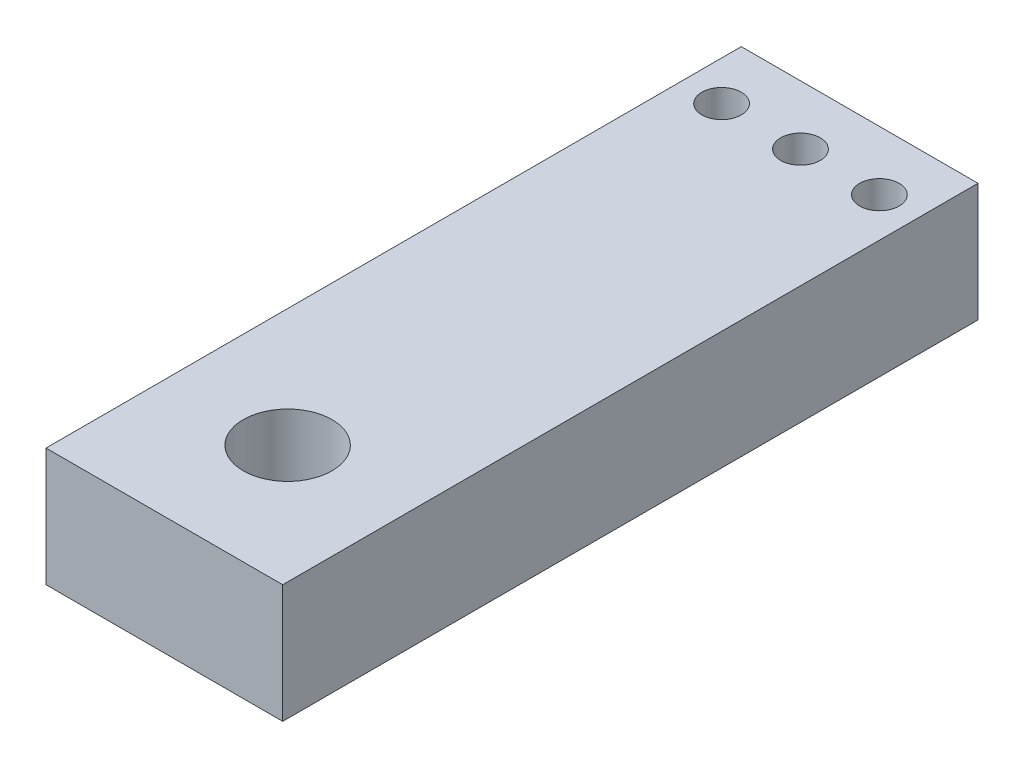
ISO-10303-21;
HEADER;
FILE_DESCRIPTION(('STEP AP214'),'2;1');
FILE_NAME('part.step','',(''),(''),'','','');
FILE_SCHEMA(('AUTOMOTIVE_DESIGN { 1 0 10303 214 1 1 1 1 }'));
ENDSEC;
DATA;
#1=APPLICATION_CONTEXT('core data for automotive mechanical design processes');
#2=APPLICATION_PROTOCOL_DEFINITION('international standard','automotive_design',2000,#1);
#3=PRODUCT_CONTEXT('',#1,'mechanical');
#4=PRODUCT('Part','Part','',(#3));
#5=PRODUCT_RELATED_PRODUCT_CATEGORY('part','',(#4));
#6=PRODUCT_DEFINITION_FORMATION('','',#4);
#7=PRODUCT_DEFINITION_CONTEXT('part definition',#1,'design');
#8=PRODUCT_DEFINITION('design','',#6,#7);
#9=PRODUCT_DEFINITION_SHAPE('','',#8);
#10=(LENGTH_UNIT() NAMED_UNIT(*) SI_UNIT(.MILLI.,.METRE.));
#11=(NAMED_UNIT(*) PLANE_ANGLE_UNIT() SI_UNIT($,.RADIAN.));
#12=(NAMED_UNIT(*) SI_UNIT($,.STERADIAN.) SOLID_ANGLE_UNIT());
#13=UNCERTAINTY_MEASURE_WITH_UNIT(LENGTH_MEASURE(1.E-05),#10,'distance_accuracy_value','');
#14=(GEOMETRIC_REPRESENTATION_CONTEXT(3) GLOBAL_UNCERTAINTY_ASSIGNED_CONTEXT((#13)) GLOBAL_UNIT_ASSIGNED_CONTEXT((#10,
#11,#12)) REPRESENTATION_CONTEXT('',''));
#15=CARTESIAN_POINT('',(0.,0.,0.));
#16=DIRECTION('',(0.,0.,1.));
#17=DIRECTION('',(1.,0.,0.));
#18=AXIS2_PLACEMENT_3D('',#15,#16,#17);
#19=CARTESIAN_POINT('',(0.,6.,0.));
#20=DIRECTION('',(1.,0.,0.));
#21=DIRECTION('',(0.,0.,-1.));
#22=AXIS2_PLACEMENT_3D('',#19,#20,#21);
#23=PLANE('',#22);
#24=DIRECTION('',(0.,0.,1.));
#25=VECTOR('',#24,1.);
#26=CARTESIAN_POINT('',(0.,0.,0.));
#27=LINE('',#26,#25);
#28=CARTESIAN_POINT('',(0.,0.,-35.25));
#29=VERTEX_POINT('',#28);
#30=CARTESIAN_POINT('',(0.,0.,0.));
#31=VERTEX_POINT('',#30);
#32=EDGE_CURVE('E98',#29,#31,#27,.T.);
#33=ORIENTED_EDGE('',*,*,#32,.T.);
#34=DIRECTION('',(0.,-1.,0.));
#35=VECTOR('',#34,1.);
#36=CARTESIAN_POINT('',(0.,6.,0.));
#37=LINE('',#36,#35);
#38=CARTESIAN_POINT('',(0.,6.,0.));
#39=VERTEX_POINT('',#38);
#40=EDGE_CURVE('E11',#39,#31,#37,.T.);
#41=ORIENTED_EDGE('',*,*,#40,.F.);
#42=DIRECTION('',(0.,0.,1.));
#43=VECTOR('',#42,1.);
#44=CARTESIAN_POINT('',(0.,6.,0.));
#45=LINE('',#44,#43);
#46=CARTESIAN_POINT('',(0.,6.,-35.25));
#47=VERTEX_POINT('',#46);
#48=EDGE_CURVE('E86',#47,#39,#45,.T.);
#49=ORIENTED_EDGE('',*,*,#48,.F.);
#50=DIRECTION('',(0.,-1.,0.));
#51=VECTOR('',#50,1.);
#52=CARTESIAN_POINT('',(0.,6.,-35.25));
#53=LINE('',#52,#51);
#54=EDGE_CURVE('E94',#47,#29,#53,.T.);
#55=ORIENTED_EDGE('',*,*,#54,.T.);
#56=EDGE_LOOP('',(#33,#41,#49,#55));
#57=FACE_BOUND('',#56,.T.);
#58=ADVANCED_FACE('F35',(#57),#23,.F.);
#59=CARTESIAN_POINT('',(0.,6.,0.));
#60=DIRECTION('',(0.,0.,-1.));
#61=DIRECTION('',(-1.,0.,0.));
#62=AXIS2_PLACEMENT_3D('',#59,#60,#61);
#63=PLANE('',#62);
#64=DIRECTION('',(1.,0.,0.));
#65=VECTOR('',#64,1.);
#66=CARTESIAN_POINT('',(0.,0.,0.));
#67=LINE('',#66,#65);
#68=CARTESIAN_POINT('',(12.,0.,0.));
#69=VERTEX_POINT('',#68);
#70=EDGE_CURVE('E90',#31,#69,#67,.T.);
#71=ORIENTED_EDGE('',*,*,#70,.T.);
#72=DIRECTION('',(0.,-1.,0.));
#73=VECTOR('',#72,1.);
#74=CARTESIAN_POINT('',(12.,6.,0.));
#75=LINE('',#74,#73);
#76=CARTESIAN_POINT('',(12.,6.,0.));
#77=VERTEX_POINT('',#76);
#78=EDGE_CURVE('E43',#77,#69,#75,.T.);
#79=ORIENTED_EDGE('',*,*,#78,.F.);
#80=DIRECTION('',(1.,0.,0.));
#81=VECTOR('',#80,1.);
#82=CARTESIAN_POINT('',(0.,6.,0.));
#83=LINE('',#82,#81);
#84=EDGE_CURVE('E81',#39,#77,#83,.T.);
#85=ORIENTED_EDGE('',*,*,#84,.F.);
#86=ORIENTED_EDGE('',*,*,#40,.T.);
#87=EDGE_LOOP('',(#71,#79,#85,#86));
#88=FACE_BOUND('',#87,.T.);
#89=ADVANCED_FACE('F89',(#88),#63,.F.);
#90=CARTESIAN_POINT('',(12.,6.,0.));
#91=DIRECTION('',(-1.,0.,0.));
#92=DIRECTION('',(0.,0.,1.));
#93=AXIS2_PLACEMENT_3D('',#90,#91,#92);
#94=PLANE('',#93);
#95=DIRECTION('',(0.,0.,-1.));
#96=VECTOR('',#95,1.);
#97=CARTESIAN_POINT('',(12.,0.,0.));
#98=LINE('',#97,#96);
#99=CARTESIAN_POINT('',(12.,0.,-35.25));
#100=VERTEX_POINT('',#99);
#101=EDGE_CURVE('E68',#69,#100,#98,.T.);
#102=ORIENTED_EDGE('',*,*,#101,.T.);
#103=DIRECTION('',(0.,-1.,0.));
#104=VECTOR('',#103,1.);
#105=CARTESIAN_POINT('',(12.,6.,-35.25));
#106=LINE('',#105,#104);
#107=CARTESIAN_POINT('',(12.,6.,-35.25));
#108=VERTEX_POINT('',#107);
#109=EDGE_CURVE('E91',#108,#100,#106,.T.);
#110=ORIENTED_EDGE('',*,*,#109,.F.);
#111=DIRECTION('',(0.,0.,-1.));
#112=VECTOR('',#111,1.);
#113=CARTESIAN_POINT('',(12.,6.,0.));
#114=LINE('',#113,#112);
#115=EDGE_CURVE('E84',#77,#108,#114,.T.);
#116=ORIENTED_EDGE('',*,*,#115,.F.);
#117=ORIENTED_EDGE('',*,*,#78,.T.);
#118=EDGE_LOOP('',(#102,#110,#116,#117));
#119=FACE_BOUND('',#118,.T.);
#120=ADVANCED_FACE('F92',(#119),#94,.F.);
#121=CARTESIAN_POINT('',(0.,6.,-35.25));
#122=DIRECTION('',(0.,0.,1.));
#123=DIRECTION('',(1.,0.,0.));
#124=AXIS2_PLACEMENT_3D('',#121,#122,#123);
#125=PLANE('',#124);
#126=DIRECTION('',(-1.,0.,0.));
#127=VECTOR('',#126,1.);
#128=CARTESIAN_POINT('',(0.,0.,-35.25));
#129=LINE('',#128,#127);
#130=EDGE_CURVE('E74',#100,#29,#129,.T.);
#131=ORIENTED_EDGE('',*,*,#130,.T.);
#132=ORIENTED_EDGE('',*,*,#54,.F.);
#133=DIRECTION('',(-1.,0.,0.));
#134=VECTOR('',#133,1.);
#135=CARTESIAN_POINT('',(0.,6.,-35.25));
#136=LINE('',#135,#134);
#137=EDGE_CURVE('E51',#108,#47,#136,.T.);
#138=ORIENTED_EDGE('',*,*,#137,.F.);
#139=ORIENTED_EDGE('',*,*,#109,.T.);
#140=EDGE_LOOP('',(#131,#132,#138,#139));
#141=FACE_BOUND('',#140,.T.);
#142=ADVANCED_FACE('F106',(#141),#125,.F.);
#143=CARTESIAN_POINT('',(0.,6.,0.));
#144=DIRECTION('',(0.,-1.,0.));
#145=DIRECTION('',(0.,0.,-1.));
#146=AXIS2_PLACEMENT_3D('',#143,#144,#145);
#147=PLANE('',#146);
#148=CARTESIAN_POINT('',(6.,6.,-32.25));
#149=DIRECTION('',(0.,1.,0.));
#150=DIRECTION('',(0.,0.,1.));
#151=AXIS2_PLACEMENT_3D('',#148,#149,#150);
#152=CIRCLE('',#151,1.);
#153=CARTESIAN_POINT('',(6.,6.,-31.25));
#154=VERTEX_POINT('',#153);
#155=EDGE_CURVE('E130',#154,#154,#152,.T.);
#156=ORIENTED_EDGE('',*,*,#155,.F.);
#157=EDGE_LOOP('',(#156));
#158=FACE_BOUND('',#157,.T.);
#159=CARTESIAN_POINT('',(2.,6.,-32.25));
#160=DIRECTION('',(0.,1.,0.));
#161=DIRECTION('',(0.,0.,1.));
#162=AXIS2_PLACEMENT_3D('',#159,#160,#161);
#163=CIRCLE('',#162,1.);
#164=CARTESIAN_POINT('',(2.,6.,-31.25));
#165=VERTEX_POINT('',#164);
#166=EDGE_CURVE('E124',#165,#165,#163,.T.);
#167=ORIENTED_EDGE('',*,*,#166,.F.);
#168=EDGE_LOOP('',(#167));
#169=FACE_BOUND('',#168,.T.);
#170=CARTESIAN_POINT('',(6.,6.,-6.25));
#171=DIRECTION('',(0.,1.,0.));
#172=DIRECTION('',(0.,0.,1.));
#173=AXIS2_PLACEMENT_3D('',#170,#171,#172);
#174=CIRCLE('',#173,2.25);
#175=CARTESIAN_POINT('',(6.,6.,-4.));
#176=VERTEX_POINT('',#175);
#177=EDGE_CURVE('E118',#176,#176,#174,.T.);
#178=ORIENTED_EDGE('',*,*,#177,.F.);
#179=EDGE_LOOP('',(#178));
#180=FACE_BOUND('',#179,.T.);
#181=CARTESIAN_POINT('',(10.,6.,-32.25));
#182=DIRECTION('',(0.,1.,0.));
#183=DIRECTION('',(0.,0.,1.));
#184=AXIS2_PLACEMENT_3D('',#181,#182,#183);
#185=CIRCLE('',#184,1.);
#186=CARTESIAN_POINT('',(10.,6.,-31.25));
#187=VERTEX_POINT('',#186);
#188=EDGE_CURVE('E112',#187,#187,#185,.T.);
#189=ORIENTED_EDGE('',*,*,#188,.F.);
#190=EDGE_LOOP('',(#189));
#191=FACE_BOUND('',#190,.T.);
#192=ORIENTED_EDGE('',*,*,#48,.T.);
#193=ORIENTED_EDGE('',*,*,#84,.T.);
#194=ORIENTED_EDGE('',*,*,#115,.T.);
#195=ORIENTED_EDGE('',*,*,#137,.T.);
#196=EDGE_LOOP('',(#192,#193,#194,#195));
#197=FACE_BOUND('',#196,.T.);
#198=ADVANCED_FACE('F82',(#158,#169,#180,#191,#197),#147,.F.);
#199=CARTESIAN_POINT('',(0.,0.,0.));
#200=DIRECTION('',(0.,-1.,0.));
#201=DIRECTION('',(0.,0.,-1.));
#202=AXIS2_PLACEMENT_3D('',#199,#200,#201);
#203=PLANE('',#202);
#204=CARTESIAN_POINT('',(6.,0.,-32.25));
#205=DIRECTION('',(0.,1.,0.));
#206=DIRECTION('',(0.,0.,1.));
#207=AXIS2_PLACEMENT_3D('',#204,#205,#206);
#208=CIRCLE('',#207,1.);
#209=CARTESIAN_POINT('',(6.,0.,-31.25));
#210=VERTEX_POINT('',#209);
#211=EDGE_CURVE('E127',#210,#210,#208,.T.);
#212=ORIENTED_EDGE('',*,*,#211,.T.);
#213=EDGE_LOOP('',(#212));
#214=FACE_BOUND('',#213,.T.);
#215=CARTESIAN_POINT('',(2.,0.,-32.25));
#216=DIRECTION('',(0.,1.,0.));
#217=DIRECTION('',(0.,0.,1.));
#218=AXIS2_PLACEMENT_3D('',#215,#216,#217);
#219=CIRCLE('',#218,1.);
#220=CARTESIAN_POINT('',(2.,0.,-31.25));
#221=VERTEX_POINT('',#220);
#222=EDGE_CURVE('E121',#221,#221,#219,.T.);
#223=ORIENTED_EDGE('',*,*,#222,.T.);
#224=EDGE_LOOP('',(#223));
#225=FACE_BOUND('',#224,.T.);
#226=CARTESIAN_POINT('',(6.,0.,-6.25));
#227=DIRECTION('',(0.,1.,0.));
#228=DIRECTION('',(0.,0.,1.));
#229=AXIS2_PLACEMENT_3D('',#226,#227,#228);
#230=CIRCLE('',#229,2.25);
#231=CARTESIAN_POINT('',(6.,0.,-4.));
#232=VERTEX_POINT('',#231);
#233=EDGE_CURVE('E115',#232,#232,#230,.T.);
#234=ORIENTED_EDGE('',*,*,#233,.T.);
#235=EDGE_LOOP('',(#234));
#236=FACE_BOUND('',#235,.T.);
#237=CARTESIAN_POINT('',(10.,0.,-32.25));
#238=DIRECTION('',(0.,1.,0.));
#239=DIRECTION('',(0.,0.,1.));
#240=AXIS2_PLACEMENT_3D('',#237,#238,#239);
#241=CIRCLE('',#240,1.);
#242=CARTESIAN_POINT('',(10.,0.,-31.25));
#243=VERTEX_POINT('',#242);
#244=EDGE_CURVE('E101',#243,#243,#241,.T.);
#245=ORIENTED_EDGE('',*,*,#244,.T.);
#246=EDGE_LOOP('',(#245));
#247=FACE_BOUND('',#246,.T.);
#248=ORIENTED_EDGE('',*,*,#32,.F.);
#249=ORIENTED_EDGE('',*,*,#130,.F.);
#250=ORIENTED_EDGE('',*,*,#101,.F.);
#251=ORIENTED_EDGE('',*,*,#70,.F.);
#252=EDGE_LOOP('',(#248,#249,#250,#251));
#253=FACE_BOUND('',#252,.T.);
#254=ADVANCED_FACE('F109',(#214,#225,#236,#247,#253),#203,.T.);
#255=CARTESIAN_POINT('',(10.,0.,-32.25));
#256=DIRECTION('',(0.,1.,0.));
#257=DIRECTION('',(0.,0.,1.));
#258=AXIS2_PLACEMENT_3D('',#255,#256,#257);
#259=CYLINDRICAL_SURFACE('',#258,1.);
#260=ORIENTED_EDGE('',*,*,#244,.F.);
#261=EDGE_LOOP('',(#260));
#262=FACE_BOUND('',#261,.T.);
#263=ORIENTED_EDGE('',*,*,#188,.T.);
#264=EDGE_LOOP('',(#263));
#265=FACE_BOUND('',#264,.T.);
#266=ADVANCED_FACE('F154',(#262,#265),#259,.F.);
#267=CARTESIAN_POINT('',(6.,0.,-6.25));
#268=DIRECTION('',(0.,1.,0.));
#269=DIRECTION('',(0.,0.,1.));
#270=AXIS2_PLACEMENT_3D('',#267,#268,#269);
#271=CYLINDRICAL_SURFACE('',#270,2.25);
#272=ORIENTED_EDGE('',*,*,#233,.F.);
#273=EDGE_LOOP('',(#272));
#274=FACE_BOUND('',#273,.T.);
#275=ORIENTED_EDGE('',*,*,#177,.T.);
#276=EDGE_LOOP('',(#275));
#277=FACE_BOUND('',#276,.T.);
#278=ADVANCED_FACE('F156',(#274,#277),#271,.F.);
#279=CARTESIAN_POINT('',(2.,0.,-32.25));
#280=DIRECTION('',(0.,1.,0.));
#281=DIRECTION('',(0.,0.,1.));
#282=AXIS2_PLACEMENT_3D('',#279,#280,#281);
#283=CYLINDRICAL_SURFACE('',#282,1.);
#284=ORIENTED_EDGE('',*,*,#222,.F.);
#285=EDGE_LOOP('',(#284));
#286=FACE_BOUND('',#285,.T.);
#287=ORIENTED_EDGE('',*,*,#166,.T.);
#288=EDGE_LOOP('',(#287));
#289=FACE_BOUND('',#288,.T.);
#290=ADVANCED_FACE('F141',(#286,#289),#283,.F.);
#291=CARTESIAN_POINT('',(6.,0.,-32.25));
#292=DIRECTION('',(0.,1.,0.));
#293=DIRECTION('',(0.,0.,1.));
#294=AXIS2_PLACEMENT_3D('',#291,#292,#293);
#295=CYLINDRICAL_SURFACE('',#294,1.);
#296=ORIENTED_EDGE('',*,*,#211,.F.);
#297=EDGE_LOOP('',(#296));
#298=FACE_BOUND('',#297,.T.);
#299=ORIENTED_EDGE('',*,*,#155,.T.);
#300=EDGE_LOOP('',(#299));
#301=FACE_BOUND('',#300,.T.);
#302=ADVANCED_FACE('F138',(#298,#301),#295,.F.);
#303=CLOSED_SHELL('',(#58,#89,#120,#142,#198,#254,#266,#278,#290,#302));
#304=MANIFOLD_SOLID_BREP('B2',#303);
#305=ADVANCED_BREP_SHAPE_REPRESENTATION('',(#18,#304),#14);
#306=SHAPE_DEFINITION_REPRESENTATION(#9,#305);
ENDSEC;
END-ISO-10303-21;
